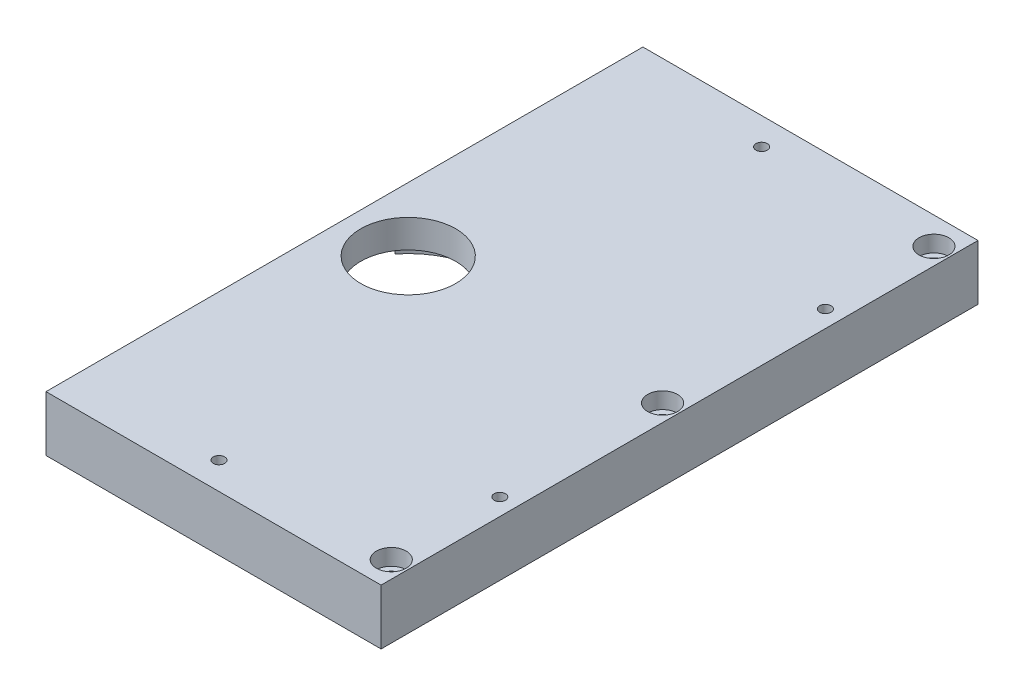
ISO-10303-21;
HEADER;
FILE_DESCRIPTION(('STEP AP214'),'2;1');
FILE_NAME('part.step','',(''),(''),'','','');
FILE_SCHEMA(('AUTOMOTIVE_DESIGN { 1 0 10303 214 1 1 1 1 }'));
ENDSEC;
DATA;
#1=APPLICATION_CONTEXT('core data for automotive mechanical design processes');
#2=APPLICATION_PROTOCOL_DEFINITION('international standard','automotive_design',2000,#1);
#3=PRODUCT_CONTEXT('',#1,'mechanical');
#4=PRODUCT('Part','Part','',(#3));
#5=PRODUCT_RELATED_PRODUCT_CATEGORY('part','',(#4));
#6=PRODUCT_DEFINITION_FORMATION('','',#4);
#7=PRODUCT_DEFINITION_CONTEXT('part definition',#1,'design');
#8=PRODUCT_DEFINITION('design','',#6,#7);
#9=PRODUCT_DEFINITION_SHAPE('','',#8);
#10=(LENGTH_UNIT() NAMED_UNIT(*) SI_UNIT(.MILLI.,.METRE.));
#11=(NAMED_UNIT(*) PLANE_ANGLE_UNIT() SI_UNIT($,.RADIAN.));
#12=(NAMED_UNIT(*) SI_UNIT($,.STERADIAN.) SOLID_ANGLE_UNIT());
#13=UNCERTAINTY_MEASURE_WITH_UNIT(LENGTH_MEASURE(1.E-05),#10,'distance_accuracy_value','');
#14=(GEOMETRIC_REPRESENTATION_CONTEXT(3) GLOBAL_UNCERTAINTY_ASSIGNED_CONTEXT((#13)) GLOBAL_UNIT_ASSIGNED_CONTEXT((#10,
#11,#12)) REPRESENTATION_CONTEXT('',''));
#15=CARTESIAN_POINT('',(0.,0.,0.));
#16=DIRECTION('',(0.,0.,1.));
#17=DIRECTION('',(1.,0.,0.));
#18=AXIS2_PLACEMENT_3D('',#15,#16,#17);
#19=CARTESIAN_POINT('',(0.,0.,0.));
#20=DIRECTION('',(0.,-1.,0.));
#21=DIRECTION('',(0.,0.,-1.));
#22=AXIS2_PLACEMENT_3D('',#19,#20,#21);
#23=PLANE('',#22);
#24=CARTESIAN_POINT('',(53.75,0.,-9.99999999999999));
#25=DIRECTION('',(0.,1.,0.));
#26=DIRECTION('',(0.,0.,1.));
#27=AXIS2_PLACEMENT_3D('',#24,#25,#26);
#28=CIRCLE('',#27,2.1);
#29=CARTESIAN_POINT('',(53.75,0.,-7.89999999999999));
#30=VERTEX_POINT('',#29);
#31=EDGE_CURVE('E255',#30,#30,#28,.T.);
#32=ORIENTED_EDGE('',*,*,#31,.F.);
#33=EDGE_LOOP('',(#32));
#34=FACE_BOUND('',#33,.T.);
#35=CARTESIAN_POINT('',(117.25,0.,-50.));
#36=DIRECTION('',(0.,1.,0.));
#37=DIRECTION('',(0.,0.,1.));
#38=AXIS2_PLACEMENT_3D('',#35,#36,#37);
#39=CIRCLE('',#38,2.1);
#40=CARTESIAN_POINT('',(117.25,0.,-47.9));
#41=VERTEX_POINT('',#40);
#42=EDGE_CURVE('E247',#41,#41,#39,.T.);
#43=ORIENTED_EDGE('',*,*,#42,.F.);
#44=EDGE_LOOP('',(#43));
#45=FACE_BOUND('',#44,.T.);
#46=CARTESIAN_POINT('',(117.25,0.,-170.));
#47=DIRECTION('',(0.,1.,0.));
#48=DIRECTION('',(0.,0.,1.));
#49=AXIS2_PLACEMENT_3D('',#46,#47,#48);
#50=CIRCLE('',#49,2.1);
#51=CARTESIAN_POINT('',(117.25,0.,-167.9));
#52=VERTEX_POINT('',#51);
#53=EDGE_CURVE('E239',#52,#52,#50,.T.);
#54=ORIENTED_EDGE('',*,*,#53,.F.);
#55=EDGE_LOOP('',(#54));
#56=FACE_BOUND('',#55,.T.);
#57=CARTESIAN_POINT('',(53.75,0.,-210.));
#58=DIRECTION('',(0.,1.,0.));
#59=DIRECTION('',(0.,0.,1.));
#60=AXIS2_PLACEMENT_3D('',#57,#58,#59);
#61=CIRCLE('',#60,2.1);
#62=CARTESIAN_POINT('',(53.75,0.,-207.9));
#63=VERTEX_POINT('',#62);
#64=EDGE_CURVE('E231',#63,#63,#61,.T.);
#65=ORIENTED_EDGE('',*,*,#64,.F.);
#66=EDGE_LOOP('',(#65));
#67=FACE_BOUND('',#66,.T.);
#68=CARTESIAN_POINT('',(117.25,0.,-9.99999999999999));
#69=DIRECTION('',(0.,1.,0.));
#70=DIRECTION('',(0.,0.,1.));
#71=AXIS2_PLACEMENT_3D('',#68,#69,#70);
#72=CIRCLE('',#71,5.50000000000001);
#73=CARTESIAN_POINT('',(117.25,0.,-4.49999999999999));
#74=VERTEX_POINT('',#73);
#75=EDGE_CURVE('E223',#74,#74,#72,.T.);
#76=ORIENTED_EDGE('',*,*,#75,.F.);
#77=EDGE_LOOP('',(#76));
#78=FACE_BOUND('',#77,.T.);
#79=CARTESIAN_POINT('',(117.25,0.,-110.));
#80=DIRECTION('',(0.,1.,0.));
#81=DIRECTION('',(0.,0.,1.));
#82=AXIS2_PLACEMENT_3D('',#79,#80,#81);
#83=CIRCLE('',#82,5.50000000000001);
#84=CARTESIAN_POINT('',(117.25,0.,-104.5));
#85=VERTEX_POINT('',#84);
#86=EDGE_CURVE('E207',#85,#85,#83,.T.);
#87=ORIENTED_EDGE('',*,*,#86,.F.);
#88=EDGE_LOOP('',(#87));
#89=FACE_BOUND('',#88,.T.);
#90=CARTESIAN_POINT('',(23.5,0.,-110.));
#91=DIRECTION('',(0.,-1.,0.));
#92=DIRECTION('',(0.,0.,-1.));
#93=AXIS2_PLACEMENT_3D('',#90,#91,#92);
#94=CIRCLE('',#93,17.5);
#95=CARTESIAN_POINT('',(23.5,0.,-127.5));
#96=VERTEX_POINT('',#95);
#97=EDGE_CURVE('E132',#96,#96,#94,.T.);
#98=ORIENTED_EDGE('',*,*,#97,.T.);
#99=EDGE_LOOP('',(#98));
#100=FACE_BOUND('',#99,.T.);
#101=DIRECTION('',(0.,0.,1.));
#102=VECTOR('',#101,1.);
#103=CARTESIAN_POINT('',(0.,0.,0.));
#104=LINE('',#103,#102);
#105=CARTESIAN_POINT('',(0.,0.,-220.));
#106=VERTEX_POINT('',#105);
#107=CARTESIAN_POINT('',(0.,0.,0.));
#108=VERTEX_POINT('',#107);
#109=EDGE_CURVE('E143',#106,#108,#104,.T.);
#110=ORIENTED_EDGE('',*,*,#109,.T.);
#111=DIRECTION('',(1.,0.,0.));
#112=VECTOR('',#111,1.);
#113=CARTESIAN_POINT('',(0.,0.,0.));
#114=LINE('',#113,#112);
#115=CARTESIAN_POINT('',(123.5,0.,0.));
#116=VERTEX_POINT('',#115);
#117=EDGE_CURVE('E147',#108,#116,#114,.T.);
#118=ORIENTED_EDGE('',*,*,#117,.T.);
#119=DIRECTION('',(0.,0.,-1.));
#120=VECTOR('',#119,1.);
#121=CARTESIAN_POINT('',(123.5,0.,0.));
#122=LINE('',#121,#120);
#123=CARTESIAN_POINT('',(123.5,0.,-220.));
#124=VERTEX_POINT('',#123);
#125=EDGE_CURVE('E128',#116,#124,#122,.T.);
#126=ORIENTED_EDGE('',*,*,#125,.T.);
#127=DIRECTION('',(-1.,0.,0.));
#128=VECTOR('',#127,1.);
#129=CARTESIAN_POINT('',(0.,0.,-220.));
#130=LINE('',#129,#128);
#131=EDGE_CURVE('E123',#124,#106,#130,.T.);
#132=ORIENTED_EDGE('',*,*,#131,.T.);
#133=EDGE_LOOP('',(#110,#118,#126,#132));
#134=FACE_BOUND('',#133,.T.);
#135=CARTESIAN_POINT('',(117.25,0.,-210.));
#136=DIRECTION('',(0.,1.,0.));
#137=DIRECTION('',(0.,0.,1.));
#138=AXIS2_PLACEMENT_3D('',#135,#136,#137);
#139=CIRCLE('',#138,5.50000000000001);
#140=CARTESIAN_POINT('',(117.25,0.,-204.5));
#141=VERTEX_POINT('',#140);
#142=EDGE_CURVE('E191',#141,#141,#139,.T.);
#143=ORIENTED_EDGE('',*,*,#142,.F.);
#144=EDGE_LOOP('',(#143));
#145=FACE_BOUND('',#144,.T.);
#146=ADVANCED_FACE('F43',(#34,#45,#56,#67,#78,#89,#100,#134,#145),#23,.F.);
#147=CARTESIAN_POINT('',(23.5,0.,-110.));
#148=DIRECTION('',(0.,-1.,0.));
#149=DIRECTION('',(0.,0.,-1.));
#150=AXIS2_PLACEMENT_3D('',#147,#148,#149);
#151=CYLINDRICAL_SURFACE('',#150,17.5);
#152=ORIENTED_EDGE('',*,*,#97,.F.);
#153=EDGE_LOOP('',(#152));
#154=FACE_BOUND('',#153,.T.);
#155=CARTESIAN_POINT('',(23.5,-10.4,-110.));
#156=DIRECTION('',(0.,-1.,0.));
#157=DIRECTION('',(0.,0.,-1.));
#158=AXIS2_PLACEMENT_3D('',#155,#156,#157);
#159=CIRCLE('',#158,17.5);
#160=CARTESIAN_POINT('',(23.5,-10.4,-127.5));
#161=VERTEX_POINT('',#160);
#162=EDGE_CURVE('E110',#161,#161,#159,.T.);
#163=ORIENTED_EDGE('',*,*,#162,.T.);
#164=EDGE_LOOP('',(#163));
#165=FACE_BOUND('',#164,.T.);
#166=ADVANCED_FACE('F264',(#154,#165),#151,.F.);
#167=CARTESIAN_POINT('',(0.,-20.4,0.));
#168=DIRECTION('',(-1.,0.,0.));
#169=DIRECTION('',(0.,0.,1.));
#170=AXIS2_PLACEMENT_3D('',#167,#168,#169);
#171=PLANE('',#170);
#172=DIRECTION('',(0.,-1.,0.));
#173=VECTOR('',#172,1.);
#174=CARTESIAN_POINT('',(0.,-10.4,-128.648056198972));
#175=LINE('',#174,#173);
#176=CARTESIAN_POINT('',(0.,-10.4,-128.648056198972));
#177=VERTEX_POINT('',#176);
#178=CARTESIAN_POINT('',(0.,-20.4,-128.648056198972));
#179=VERTEX_POINT('',#178);
#180=EDGE_CURVE('E61',#177,#179,#175,.T.);
#181=ORIENTED_EDGE('',*,*,#180,.F.);
#182=DIRECTION('',(0.,0.,1.));
#183=VECTOR('',#182,1.);
#184=CARTESIAN_POINT('',(0.,-10.4,0.));
#185=LINE('',#184,#183);
#186=CARTESIAN_POINT('',(0.,-10.4,-91.3519438010285));
#187=VERTEX_POINT('',#186);
#188=EDGE_CURVE('E113',#177,#187,#185,.T.);
#189=ORIENTED_EDGE('',*,*,#188,.T.);
#190=DIRECTION('',(0.,-1.,0.));
#191=VECTOR('',#190,1.);
#192=CARTESIAN_POINT('',(0.,-10.4,-91.3519438010285));
#193=LINE('',#192,#191);
#194=CARTESIAN_POINT('',(0.,-20.4,-91.3519438010285));
#195=VERTEX_POINT('',#194);
#196=EDGE_CURVE('E105',#195,#187,#193,.F.);
#197=ORIENTED_EDGE('',*,*,#196,.F.);
#198=DIRECTION('',(0.,0.,1.));
#199=VECTOR('',#198,1.);
#200=CARTESIAN_POINT('',(0.,-20.4,0.));
#201=LINE('',#200,#199);
#202=CARTESIAN_POINT('',(0.,-20.4,0.));
#203=VERTEX_POINT('',#202);
#204=EDGE_CURVE('E93',#195,#203,#201,.T.);
#205=ORIENTED_EDGE('',*,*,#204,.T.);
#206=DIRECTION('',(0.,1.,0.));
#207=VECTOR('',#206,1.);
#208=CARTESIAN_POINT('',(0.,-20.4,0.));
#209=LINE('',#208,#207);
#210=EDGE_CURVE('E47',#203,#108,#209,.T.);
#211=ORIENTED_EDGE('',*,*,#210,.T.);
#212=ORIENTED_EDGE('',*,*,#109,.F.);
#213=DIRECTION('',(0.,1.,0.));
#214=VECTOR('',#213,1.);
#215=CARTESIAN_POINT('',(0.,-20.4,-220.));
#216=LINE('',#215,#214);
#217=CARTESIAN_POINT('',(0.,-20.4,-220.));
#218=VERTEX_POINT('',#217);
#219=EDGE_CURVE('E11',#218,#106,#216,.T.);
#220=ORIENTED_EDGE('',*,*,#219,.F.);
#221=EDGE_CURVE('E122',#218,#179,#201,.T.);
#222=ORIENTED_EDGE('',*,*,#221,.T.);
#223=EDGE_LOOP('',(#181,#189,#197,#205,#211,#212,#220,#222));
#224=FACE_BOUND('',#223,.T.);
#225=ADVANCED_FACE('F45',(#224),#171,.T.);
#226=CARTESIAN_POINT('',(0.,-20.4,-220.));
#227=DIRECTION('',(0.,0.,-1.));
#228=DIRECTION('',(-1.,0.,0.));
#229=AXIS2_PLACEMENT_3D('',#226,#227,#228);
#230=PLANE('',#229);
#231=ORIENTED_EDGE('',*,*,#131,.F.);
#232=DIRECTION('',(0.,1.,0.));
#233=VECTOR('',#232,1.);
#234=CARTESIAN_POINT('',(123.5,-20.4,-220.));
#235=LINE('',#234,#233);
#236=CARTESIAN_POINT('',(123.5,-20.4,-220.));
#237=VERTEX_POINT('',#236);
#238=EDGE_CURVE('E53',#237,#124,#235,.T.);
#239=ORIENTED_EDGE('',*,*,#238,.F.);
#240=DIRECTION('',(-1.,0.,0.));
#241=VECTOR('',#240,1.);
#242=CARTESIAN_POINT('',(0.,-20.4,-220.));
#243=LINE('',#242,#241);
#244=EDGE_CURVE('E140',#237,#218,#243,.T.);
#245=ORIENTED_EDGE('',*,*,#244,.T.);
#246=ORIENTED_EDGE('',*,*,#219,.T.);
#247=EDGE_LOOP('',(#231,#239,#245,#246));
#248=FACE_BOUND('',#247,.T.);
#249=ADVANCED_FACE('F164',(#248),#230,.T.);
#250=CARTESIAN_POINT('',(123.5,-20.4,0.));
#251=DIRECTION('',(1.,0.,0.));
#252=DIRECTION('',(0.,0.,-1.));
#253=AXIS2_PLACEMENT_3D('',#250,#251,#252);
#254=PLANE('',#253);
#255=ORIENTED_EDGE('',*,*,#125,.F.);
#256=DIRECTION('',(0.,1.,0.));
#257=VECTOR('',#256,1.);
#258=CARTESIAN_POINT('',(123.5,-20.4,0.));
#259=LINE('',#258,#257);
#260=CARTESIAN_POINT('',(123.5,-20.4,0.));
#261=VERTEX_POINT('',#260);
#262=EDGE_CURVE('E155',#261,#116,#259,.T.);
#263=ORIENTED_EDGE('',*,*,#262,.F.);
#264=DIRECTION('',(0.,0.,-1.));
#265=VECTOR('',#264,1.);
#266=CARTESIAN_POINT('',(123.5,-20.4,0.));
#267=LINE('',#266,#265);
#268=EDGE_CURVE('E136',#261,#237,#267,.T.);
#269=ORIENTED_EDGE('',*,*,#268,.T.);
#270=ORIENTED_EDGE('',*,*,#238,.T.);
#271=EDGE_LOOP('',(#255,#263,#269,#270));
#272=FACE_BOUND('',#271,.T.);
#273=ADVANCED_FACE('F167',(#272),#254,.T.);
#274=CARTESIAN_POINT('',(0.,-20.4,0.));
#275=DIRECTION('',(0.,0.,1.));
#276=DIRECTION('',(1.,0.,0.));
#277=AXIS2_PLACEMENT_3D('',#274,#275,#276);
#278=PLANE('',#277);
#279=ORIENTED_EDGE('',*,*,#117,.F.);
#280=ORIENTED_EDGE('',*,*,#210,.F.);
#281=DIRECTION('',(1.,0.,0.));
#282=VECTOR('',#281,1.);
#283=CARTESIAN_POINT('',(0.,-20.4,0.));
#284=LINE('',#283,#282);
#285=EDGE_CURVE('E120',#203,#261,#284,.T.);
#286=ORIENTED_EDGE('',*,*,#285,.T.);
#287=ORIENTED_EDGE('',*,*,#262,.T.);
#288=EDGE_LOOP('',(#279,#280,#286,#287));
#289=FACE_BOUND('',#288,.T.);
#290=ADVANCED_FACE('F161',(#289),#278,.T.);
#291=CARTESIAN_POINT('',(0.,-20.4,0.));
#292=DIRECTION('',(0.,-1.,0.));
#293=DIRECTION('',(0.,0.,-1.));
#294=AXIS2_PLACEMENT_3D('',#291,#292,#293);
#295=PLANE('',#294);
#296=CARTESIAN_POINT('',(53.75,-20.4,-9.99999999999999));
#297=DIRECTION('',(0.,1.,0.));
#298=DIRECTION('',(0.,0.,1.));
#299=AXIS2_PLACEMENT_3D('',#296,#297,#298);
#300=CIRCLE('',#299,2.1);
#301=CARTESIAN_POINT('',(53.75,-20.4,-7.89999999999999));
#302=VERTEX_POINT('',#301);
#303=EDGE_CURVE('E251',#302,#302,#300,.T.);
#304=ORIENTED_EDGE('',*,*,#303,.T.);
#305=EDGE_LOOP('',(#304));
#306=FACE_BOUND('',#305,.T.);
#307=CARTESIAN_POINT('',(117.25,-20.4,-50.));
#308=DIRECTION('',(0.,1.,0.));
#309=DIRECTION('',(0.,0.,1.));
#310=AXIS2_PLACEMENT_3D('',#307,#308,#309);
#311=CIRCLE('',#310,2.09999999999999);
#312=CARTESIAN_POINT('',(117.25,-20.4,-47.9));
#313=VERTEX_POINT('',#312);
#314=EDGE_CURVE('E243',#313,#313,#311,.T.);
#315=ORIENTED_EDGE('',*,*,#314,.T.);
#316=EDGE_LOOP('',(#315));
#317=FACE_BOUND('',#316,.T.);
#318=CARTESIAN_POINT('',(117.25,-20.4,-170.));
#319=DIRECTION('',(0.,1.,0.));
#320=DIRECTION('',(0.,0.,1.));
#321=AXIS2_PLACEMENT_3D('',#318,#319,#320);
#322=CIRCLE('',#321,2.09999999999999);
#323=CARTESIAN_POINT('',(117.25,-20.4,-167.9));
#324=VERTEX_POINT('',#323);
#325=EDGE_CURVE('E235',#324,#324,#322,.T.);
#326=ORIENTED_EDGE('',*,*,#325,.T.);
#327=EDGE_LOOP('',(#326));
#328=FACE_BOUND('',#327,.T.);
#329=CARTESIAN_POINT('',(53.75,-20.4,-210.));
#330=DIRECTION('',(0.,1.,0.));
#331=DIRECTION('',(0.,0.,1.));
#332=AXIS2_PLACEMENT_3D('',#329,#330,#331);
#333=CIRCLE('',#332,2.1);
#334=CARTESIAN_POINT('',(53.75,-20.4,-207.9));
#335=VERTEX_POINT('',#334);
#336=EDGE_CURVE('E227',#335,#335,#333,.T.);
#337=ORIENTED_EDGE('',*,*,#336,.T.);
#338=EDGE_LOOP('',(#337));
#339=FACE_BOUND('',#338,.T.);
#340=CARTESIAN_POINT('',(117.25,-20.4,-9.99999999999999));
#341=DIRECTION('',(0.,1.,0.));
#342=DIRECTION('',(0.,0.,1.));
#343=AXIS2_PLACEMENT_3D('',#340,#341,#342);
#344=CIRCLE('',#343,3.3);
#345=CARTESIAN_POINT('',(117.25,-20.4,-6.7));
#346=VERTEX_POINT('',#345);
#347=EDGE_CURVE('E211',#346,#346,#344,.T.);
#348=ORIENTED_EDGE('',*,*,#347,.T.);
#349=EDGE_LOOP('',(#348));
#350=FACE_BOUND('',#349,.T.);
#351=CARTESIAN_POINT('',(117.25,-20.4,-110.));
#352=DIRECTION('',(0.,1.,0.));
#353=DIRECTION('',(0.,0.,1.));
#354=AXIS2_PLACEMENT_3D('',#351,#352,#353);
#355=CIRCLE('',#354,3.3);
#356=CARTESIAN_POINT('',(117.25,-20.4,-106.7));
#357=VERTEX_POINT('',#356);
#358=EDGE_CURVE('E195',#357,#357,#355,.T.);
#359=ORIENTED_EDGE('',*,*,#358,.T.);
#360=EDGE_LOOP('',(#359));
#361=FACE_BOUND('',#360,.T.);
#362=CARTESIAN_POINT('',(117.25,-20.4,-210.));
#363=DIRECTION('',(0.,1.,0.));
#364=DIRECTION('',(0.,0.,1.));
#365=AXIS2_PLACEMENT_3D('',#362,#363,#364);
#366=CIRCLE('',#365,3.3);
#367=CARTESIAN_POINT('',(117.25,-20.4,-206.7));
#368=VERTEX_POINT('',#367);
#369=EDGE_CURVE('E179',#368,#368,#366,.T.);
#370=ORIENTED_EDGE('',*,*,#369,.T.);
#371=EDGE_LOOP('',(#370));
#372=FACE_BOUND('',#371,.T.);
#373=CARTESIAN_POINT('',(23.5,-20.4,-110.));
#374=DIRECTION('',(0.,-1.,0.));
#375=DIRECTION('',(0.,0.,-1.));
#376=AXIS2_PLACEMENT_3D('',#373,#374,#375);
#377=CIRCLE('',#376,30.);
#378=EDGE_CURVE('E103',#179,#195,#377,.T.);
#379=ORIENTED_EDGE('',*,*,#378,.F.);
#380=ORIENTED_EDGE('',*,*,#221,.F.);
#381=ORIENTED_EDGE('',*,*,#244,.F.);
#382=ORIENTED_EDGE('',*,*,#268,.F.);
#383=ORIENTED_EDGE('',*,*,#285,.F.);
#384=ORIENTED_EDGE('',*,*,#204,.F.);
#385=EDGE_LOOP('',(#379,#380,#381,#382,#383,#384));
#386=FACE_BOUND('',#385,.T.);
#387=ADVANCED_FACE('F117',(#306,#317,#328,#339,#350,#361,#372,#386),#295,.T.);
#388=CARTESIAN_POINT('',(23.5,-10.4,-110.));
#389=DIRECTION('',(0.,-1.,0.));
#390=DIRECTION('',(0.,0.,-1.));
#391=AXIS2_PLACEMENT_3D('',#388,#389,#390);
#392=CYLINDRICAL_SURFACE('',#391,30.);
#393=ORIENTED_EDGE('',*,*,#180,.T.);
#394=ORIENTED_EDGE('',*,*,#378,.T.);
#395=ORIENTED_EDGE('',*,*,#196,.T.);
#396=CARTESIAN_POINT('',(23.5,-10.4,-110.));
#397=DIRECTION('',(0.,-1.,0.));
#398=DIRECTION('',(0.,0.,-1.));
#399=AXIS2_PLACEMENT_3D('',#396,#397,#398);
#400=CIRCLE('',#399,30.);
#401=EDGE_CURVE('E109',#177,#187,#400,.T.);
#402=ORIENTED_EDGE('',*,*,#401,.F.);
#403=EDGE_LOOP('',(#393,#394,#395,#402));
#404=FACE_BOUND('',#403,.T.);
#405=ADVANCED_FACE('F104',(#404),#392,.F.);
#406=CARTESIAN_POINT('',(23.5,-10.4,-110.));
#407=DIRECTION('',(0.,-1.,0.));
#408=DIRECTION('',(0.,0.,-1.));
#409=AXIS2_PLACEMENT_3D('',#406,#407,#408);
#410=PLANE('',#409);
#411=ORIENTED_EDGE('',*,*,#162,.F.);
#412=EDGE_LOOP('',(#411));
#413=FACE_BOUND('',#412,.T.);
#414=ORIENTED_EDGE('',*,*,#401,.T.);
#415=ORIENTED_EDGE('',*,*,#188,.F.);
#416=EDGE_LOOP('',(#414,#415));
#417=FACE_BOUND('',#416,.T.);
#418=ADVANCED_FACE('F283',(#413,#417),#410,.T.);
#419=CARTESIAN_POINT('',(117.25,0.,-210.));
#420=DIRECTION('',(0.,1.,0.));
#421=DIRECTION('',(0.,0.,1.));
#422=AXIS2_PLACEMENT_3D('',#419,#420,#421);
#423=CYLINDRICAL_SURFACE('',#422,3.3);
#424=ORIENTED_EDGE('',*,*,#369,.F.);
#425=EDGE_LOOP('',(#424));
#426=FACE_BOUND('',#425,.T.);
#427=CARTESIAN_POINT('',(117.25,-6.,-210.));
#428=DIRECTION('',(0.,1.,0.));
#429=DIRECTION('',(0.,0.,1.));
#430=AXIS2_PLACEMENT_3D('',#427,#428,#429);
#431=CIRCLE('',#430,3.3);
#432=CARTESIAN_POINT('',(117.25,-6.,-206.7));
#433=VERTEX_POINT('',#432);
#434=EDGE_CURVE('E183',#433,#433,#431,.T.);
#435=ORIENTED_EDGE('',*,*,#434,.T.);
#436=EDGE_LOOP('',(#435));
#437=FACE_BOUND('',#436,.T.);
#438=ADVANCED_FACE('F286',(#426,#437),#423,.F.);
#439=CARTESIAN_POINT('',(120.55,-6.,-210.));
#440=DIRECTION('',(0.,-1.,0.));
#441=DIRECTION('',(0.,0.,-1.));
#442=AXIS2_PLACEMENT_3D('',#439,#440,#441);
#443=PLANE('',#442);
#444=ORIENTED_EDGE('',*,*,#434,.F.);
#445=EDGE_LOOP('',(#444));
#446=FACE_BOUND('',#445,.T.);
#447=CARTESIAN_POINT('',(117.25,-6.,-210.));
#448=DIRECTION('',(0.,1.,0.));
#449=DIRECTION('',(0.,0.,1.));
#450=AXIS2_PLACEMENT_3D('',#447,#448,#449);
#451=CIRCLE('',#450,5.50000000000001);
#452=CARTESIAN_POINT('',(117.25,-6.,-204.5));
#453=VERTEX_POINT('',#452);
#454=EDGE_CURVE('E187',#453,#453,#451,.T.);
#455=ORIENTED_EDGE('',*,*,#454,.T.);
#456=EDGE_LOOP('',(#455));
#457=FACE_BOUND('',#456,.T.);
#458=ADVANCED_FACE('F292',(#446,#457),#443,.F.);
#459=CARTESIAN_POINT('',(117.25,0.,-210.));
#460=DIRECTION('',(0.,1.,0.));
#461=DIRECTION('',(0.,0.,1.));
#462=AXIS2_PLACEMENT_3D('',#459,#460,#461);
#463=CYLINDRICAL_SURFACE('',#462,5.50000000000001);
#464=ORIENTED_EDGE('',*,*,#454,.F.);
#465=EDGE_LOOP('',(#464));
#466=FACE_BOUND('',#465,.T.);
#467=ORIENTED_EDGE('',*,*,#142,.T.);
#468=EDGE_LOOP('',(#467));
#469=FACE_BOUND('',#468,.T.);
#470=ADVANCED_FACE('F345',(#466,#469),#463,.F.);
#471=CARTESIAN_POINT('',(117.25,0.,-110.));
#472=DIRECTION('',(0.,1.,0.));
#473=DIRECTION('',(0.,0.,1.));
#474=AXIS2_PLACEMENT_3D('',#471,#472,#473);
#475=CYLINDRICAL_SURFACE('',#474,3.3);
#476=ORIENTED_EDGE('',*,*,#358,.F.);
#477=EDGE_LOOP('',(#476));
#478=FACE_BOUND('',#477,.T.);
#479=CARTESIAN_POINT('',(117.25,-6.,-110.));
#480=DIRECTION('',(0.,1.,0.));
#481=DIRECTION('',(0.,0.,1.));
#482=AXIS2_PLACEMENT_3D('',#479,#480,#481);
#483=CIRCLE('',#482,3.3);
#484=CARTESIAN_POINT('',(117.25,-6.,-106.7));
#485=VERTEX_POINT('',#484);
#486=EDGE_CURVE('E199',#485,#485,#483,.T.);
#487=ORIENTED_EDGE('',*,*,#486,.T.);
#488=EDGE_LOOP('',(#487));
#489=FACE_BOUND('',#488,.T.);
#490=ADVANCED_FACE('F354',(#478,#489),#475,.F.);
#491=CARTESIAN_POINT('',(120.55,-6.,-110.));
#492=DIRECTION('',(0.,-1.,0.));
#493=DIRECTION('',(0.,0.,-1.));
#494=AXIS2_PLACEMENT_3D('',#491,#492,#493);
#495=PLANE('',#494);
#496=ORIENTED_EDGE('',*,*,#486,.F.);
#497=EDGE_LOOP('',(#496));
#498=FACE_BOUND('',#497,.T.);
#499=CARTESIAN_POINT('',(117.25,-6.,-110.));
#500=DIRECTION('',(0.,1.,0.));
#501=DIRECTION('',(0.,0.,1.));
#502=AXIS2_PLACEMENT_3D('',#499,#500,#501);
#503=CIRCLE('',#502,5.50000000000001);
#504=CARTESIAN_POINT('',(117.25,-6.,-104.5));
#505=VERTEX_POINT('',#504);
#506=EDGE_CURVE('E203',#505,#505,#503,.T.);
#507=ORIENTED_EDGE('',*,*,#506,.T.);
#508=EDGE_LOOP('',(#507));
#509=FACE_BOUND('',#508,.T.);
#510=ADVANCED_FACE('F364',(#498,#509),#495,.F.);
#511=CARTESIAN_POINT('',(117.25,0.,-110.));
#512=DIRECTION('',(0.,1.,0.));
#513=DIRECTION('',(0.,0.,1.));
#514=AXIS2_PLACEMENT_3D('',#511,#512,#513);
#515=CYLINDRICAL_SURFACE('',#514,5.50000000000001);
#516=ORIENTED_EDGE('',*,*,#506,.F.);
#517=EDGE_LOOP('',(#516));
#518=FACE_BOUND('',#517,.T.);
#519=ORIENTED_EDGE('',*,*,#86,.T.);
#520=EDGE_LOOP('',(#519));
#521=FACE_BOUND('',#520,.T.);
#522=ADVANCED_FACE('F374',(#518,#521),#515,.F.);
#523=CARTESIAN_POINT('',(117.25,0.,-9.99999999999999));
#524=DIRECTION('',(0.,1.,0.));
#525=DIRECTION('',(0.,0.,1.));
#526=AXIS2_PLACEMENT_3D('',#523,#524,#525);
#527=CYLINDRICAL_SURFACE('',#526,3.3);
#528=ORIENTED_EDGE('',*,*,#347,.F.);
#529=EDGE_LOOP('',(#528));
#530=FACE_BOUND('',#529,.T.);
#531=CARTESIAN_POINT('',(117.25,-6.,-9.99999999999999));
#532=DIRECTION('',(0.,1.,0.));
#533=DIRECTION('',(0.,0.,1.));
#534=AXIS2_PLACEMENT_3D('',#531,#532,#533);
#535=CIRCLE('',#534,3.3);
#536=CARTESIAN_POINT('',(117.25,-6.,-6.7));
#537=VERTEX_POINT('',#536);
#538=EDGE_CURVE('E215',#537,#537,#535,.T.);
#539=ORIENTED_EDGE('',*,*,#538,.T.);
#540=EDGE_LOOP('',(#539));
#541=FACE_BOUND('',#540,.T.);
#542=ADVANCED_FACE('F384',(#530,#541),#527,.F.);
#543=CARTESIAN_POINT('',(120.55,-6.,-9.99999999999999));
#544=DIRECTION('',(0.,-1.,0.));
#545=DIRECTION('',(0.,0.,-1.));
#546=AXIS2_PLACEMENT_3D('',#543,#544,#545);
#547=PLANE('',#546);
#548=ORIENTED_EDGE('',*,*,#538,.F.);
#549=EDGE_LOOP('',(#548));
#550=FACE_BOUND('',#549,.T.);
#551=CARTESIAN_POINT('',(117.25,-6.,-9.99999999999999));
#552=DIRECTION('',(0.,1.,0.));
#553=DIRECTION('',(0.,0.,1.));
#554=AXIS2_PLACEMENT_3D('',#551,#552,#553);
#555=CIRCLE('',#554,5.50000000000001);
#556=CARTESIAN_POINT('',(117.25,-6.,-4.49999999999999));
#557=VERTEX_POINT('',#556);
#558=EDGE_CURVE('E219',#557,#557,#555,.T.);
#559=ORIENTED_EDGE('',*,*,#558,.T.);
#560=EDGE_LOOP('',(#559));
#561=FACE_BOUND('',#560,.T.);
#562=ADVANCED_FACE('F394',(#550,#561),#547,.F.);
#563=CARTESIAN_POINT('',(117.25,0.,-9.99999999999999));
#564=DIRECTION('',(0.,1.,0.));
#565=DIRECTION('',(0.,0.,1.));
#566=AXIS2_PLACEMENT_3D('',#563,#564,#565);
#567=CYLINDRICAL_SURFACE('',#566,5.50000000000001);
#568=ORIENTED_EDGE('',*,*,#558,.F.);
#569=EDGE_LOOP('',(#568));
#570=FACE_BOUND('',#569,.T.);
#571=ORIENTED_EDGE('',*,*,#75,.T.);
#572=EDGE_LOOP('',(#571));
#573=FACE_BOUND('',#572,.T.);
#574=ADVANCED_FACE('F404',(#570,#573),#567,.F.);
#575=CARTESIAN_POINT('',(53.75,0.,-210.));
#576=DIRECTION('',(0.,1.,0.));
#577=DIRECTION('',(0.,0.,1.));
#578=AXIS2_PLACEMENT_3D('',#575,#576,#577);
#579=CYLINDRICAL_SURFACE('',#578,2.1);
#580=ORIENTED_EDGE('',*,*,#336,.F.);
#581=EDGE_LOOP('',(#580));
#582=FACE_BOUND('',#581,.T.);
#583=ORIENTED_EDGE('',*,*,#64,.T.);
#584=EDGE_LOOP('',(#583));
#585=FACE_BOUND('',#584,.T.);
#586=ADVANCED_FACE('F413',(#582,#585),#579,.F.);
#587=CARTESIAN_POINT('',(117.25,0.,-170.));
#588=DIRECTION('',(0.,1.,0.));
#589=DIRECTION('',(0.,0.,1.));
#590=AXIS2_PLACEMENT_3D('',#587,#588,#589);
#591=CYLINDRICAL_SURFACE('',#590,2.1);
#592=ORIENTED_EDGE('',*,*,#325,.F.);
#593=EDGE_LOOP('',(#592));
#594=FACE_BOUND('',#593,.T.);
#595=ORIENTED_EDGE('',*,*,#53,.T.);
#596=EDGE_LOOP('',(#595));
#597=FACE_BOUND('',#596,.T.);
#598=ADVANCED_FACE('F455',(#594,#597),#591,.F.);
#599=CARTESIAN_POINT('',(117.25,0.,-50.));
#600=DIRECTION('',(0.,1.,0.));
#601=DIRECTION('',(0.,0.,1.));
#602=AXIS2_PLACEMENT_3D('',#599,#600,#601);
#603=CYLINDRICAL_SURFACE('',#602,2.1);
#604=ORIENTED_EDGE('',*,*,#314,.F.);
#605=EDGE_LOOP('',(#604));
#606=FACE_BOUND('',#605,.T.);
#607=ORIENTED_EDGE('',*,*,#42,.T.);
#608=EDGE_LOOP('',(#607));
#609=FACE_BOUND('',#608,.T.);
#610=ADVANCED_FACE('F464',(#606,#609),#603,.F.);
#611=CARTESIAN_POINT('',(53.75,0.,-9.99999999999999));
#612=DIRECTION('',(0.,1.,0.));
#613=DIRECTION('',(0.,0.,1.));
#614=AXIS2_PLACEMENT_3D('',#611,#612,#613);
#615=CYLINDRICAL_SURFACE('',#614,2.1);
#616=ORIENTED_EDGE('',*,*,#303,.F.);
#617=EDGE_LOOP('',(#616));
#618=FACE_BOUND('',#617,.T.);
#619=ORIENTED_EDGE('',*,*,#31,.T.);
#620=EDGE_LOOP('',(#619));
#621=FACE_BOUND('',#620,.T.);
#622=ADVANCED_FACE('F260',(#618,#621),#615,.F.);
#623=CLOSED_SHELL('',(#146,#166,#225,#249,#273,#290,#387,#405,#418,#438,#458,#470,#490,#510,
#522,#542,#562,#574,#586,#598,#610,#622));
#624=MANIFOLD_SOLID_BREP('B2',#623);
#625=ADVANCED_BREP_SHAPE_REPRESENTATION('',(#18,#624),#14);
#626=SHAPE_DEFINITION_REPRESENTATION(#9,#625);
ENDSEC;
END-ISO-10303-21;
